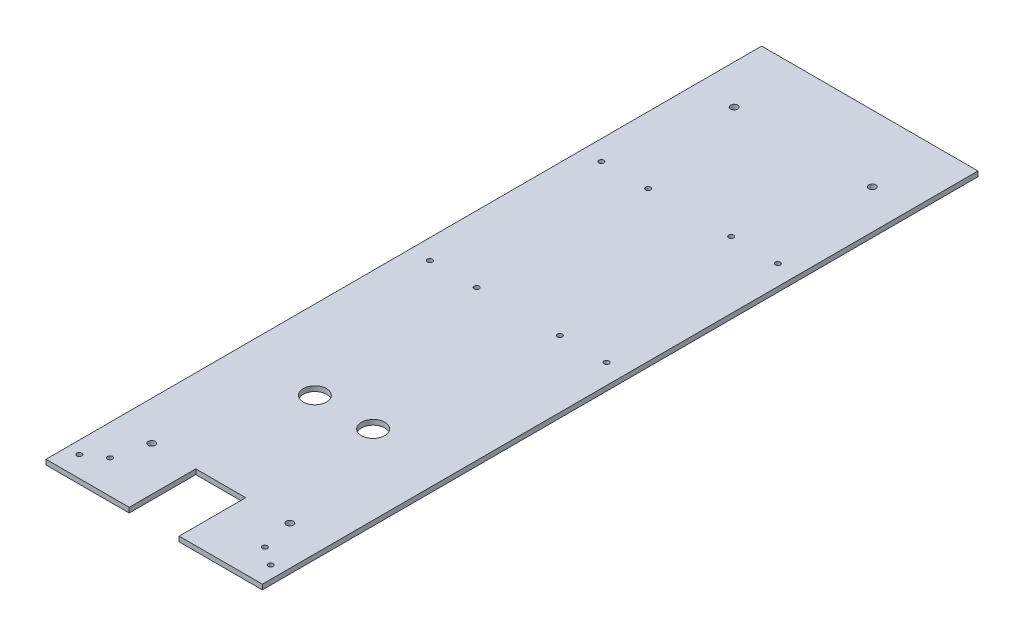
ISO-10303-21;
HEADER;
FILE_DESCRIPTION(('STEP AP214'),'2;1');
FILE_NAME('part.step','',(''),(''),'','','');
FILE_SCHEMA(('AUTOMOTIVE_DESIGN { 1 0 10303 214 1 1 1 1 }'));
ENDSEC;
DATA;
#1=APPLICATION_CONTEXT('core data for automotive mechanical design processes');
#2=APPLICATION_PROTOCOL_DEFINITION('international standard','automotive_design',2000,#1);
#3=PRODUCT_CONTEXT('',#1,'mechanical');
#4=PRODUCT('Part','Part','',(#3));
#5=PRODUCT_RELATED_PRODUCT_CATEGORY('part','',(#4));
#6=PRODUCT_DEFINITION_FORMATION('','',#4);
#7=PRODUCT_DEFINITION_CONTEXT('part definition',#1,'design');
#8=PRODUCT_DEFINITION('design','',#6,#7);
#9=PRODUCT_DEFINITION_SHAPE('','',#8);
#10=(LENGTH_UNIT() NAMED_UNIT(*) SI_UNIT(.MILLI.,.METRE.));
#11=(NAMED_UNIT(*) PLANE_ANGLE_UNIT() SI_UNIT($,.RADIAN.));
#12=(NAMED_UNIT(*) SI_UNIT($,.STERADIAN.) SOLID_ANGLE_UNIT());
#13=UNCERTAINTY_MEASURE_WITH_UNIT(LENGTH_MEASURE(1.E-05),#10,'distance_accuracy_value','');
#14=(GEOMETRIC_REPRESENTATION_CONTEXT(3) GLOBAL_UNCERTAINTY_ASSIGNED_CONTEXT((#13)) GLOBAL_UNIT_ASSIGNED_CONTEXT((#10,
#11,#12)) REPRESENTATION_CONTEXT('',''));
#15=CARTESIAN_POINT('',(0.,0.,0.));
#16=DIRECTION('',(0.,0.,1.));
#17=DIRECTION('',(1.,0.,0.));
#18=AXIS2_PLACEMENT_3D('',#15,#16,#17);
#19=CARTESIAN_POINT('',(-65.,3.,215.));
#20=DIRECTION('',(0.,0.,-1.));
#21=DIRECTION('',(-1.,0.,0.));
#22=AXIS2_PLACEMENT_3D('',#19,#20,#21);
#23=PLANE('',#22);
#24=DIRECTION('',(0.,1.,0.));
#25=VECTOR('',#24,1.);
#26=CARTESIAN_POINT('',(-15.0000000000001,-7.,215.));
#27=LINE('',#26,#25);
#28=CARTESIAN_POINT('',(-15.0000000000001,0.,215.));
#29=VERTEX_POINT('',#28);
#30=CARTESIAN_POINT('',(-15.0000000000001,3.,215.));
#31=VERTEX_POINT('',#30);
#32=EDGE_CURVE('E110',#29,#31,#27,.T.);
#33=ORIENTED_EDGE('',*,*,#32,.T.);
#34=DIRECTION('',(1.,0.,0.));
#35=VECTOR('',#34,1.);
#36=CARTESIAN_POINT('',(-65.,3.,215.));
#37=LINE('',#36,#35);
#38=CARTESIAN_POINT('',(-65.,3.,215.));
#39=VERTEX_POINT('',#38);
#40=EDGE_CURVE('E124',#39,#31,#37,.T.);
#41=ORIENTED_EDGE('',*,*,#40,.F.);
#42=DIRECTION('',(0.,-1.,0.));
#43=VECTOR('',#42,1.);
#44=CARTESIAN_POINT('',(-65.,3.,215.));
#45=LINE('',#44,#43);
#46=CARTESIAN_POINT('',(-65.,0.,215.));
#47=VERTEX_POINT('',#46);
#48=EDGE_CURVE('E135',#39,#47,#45,.T.);
#49=ORIENTED_EDGE('',*,*,#48,.T.);
#50=DIRECTION('',(1.,0.,0.));
#51=VECTOR('',#50,1.);
#52=CARTESIAN_POINT('',(-65.,0.,215.));
#53=LINE('',#52,#51);
#54=EDGE_CURVE('E126',#47,#29,#53,.T.);
#55=ORIENTED_EDGE('',*,*,#54,.T.);
#56=EDGE_LOOP('',(#33,#41,#49,#55));
#57=FACE_BOUND('',#56,.T.);
#58=ADVANCED_FACE('F33',(#57),#23,.F.);
#59=CARTESIAN_POINT('',(0.,3.,0.));
#60=DIRECTION('',(0.,1.,0.));
#61=DIRECTION('',(0.,0.,1.));
#62=AXIS2_PLACEMENT_3D('',#59,#60,#61);
#63=PLANE('',#62);
#64=CARTESIAN_POINT('',(17.4999999999999,3.,100.952208060622));
#65=DIRECTION('',(0.,1.,0.));
#66=DIRECTION('',(0.,0.,1.));
#67=AXIS2_PLACEMENT_3D('',#64,#65,#66);
#68=CIRCLE('',#67,7.);
#69=CARTESIAN_POINT('',(17.4999999999999,3.,107.952208060622));
#70=VERTEX_POINT('',#69);
#71=EDGE_CURVE('E280',#70,#70,#68,.T.);
#72=ORIENTED_EDGE('',*,*,#71,.F.);
#73=EDGE_LOOP('',(#72));
#74=FACE_BOUND('',#73,.T.);
#75=CARTESIAN_POINT('',(-17.5000000000001,3.,100.952208060622));
#76=DIRECTION('',(0.,1.,0.));
#77=DIRECTION('',(0.,0.,1.));
#78=AXIS2_PLACEMENT_3D('',#75,#76,#77);
#79=CIRCLE('',#78,7.);
#80=CARTESIAN_POINT('',(-17.5000000000001,3.,107.952208060622));
#81=VERTEX_POINT('',#80);
#82=EDGE_CURVE('E274',#81,#81,#79,.T.);
#83=ORIENTED_EDGE('',*,*,#82,.F.);
#84=EDGE_LOOP('',(#83));
#85=FACE_BOUND('',#84,.T.);
#86=CARTESIAN_POINT('',(-41.5000000000001,3.,-175.));
#87=DIRECTION('',(0.,1.,0.));
#88=DIRECTION('',(0.,0.,1.));
#89=AXIS2_PLACEMENT_3D('',#86,#87,#88);
#90=CIRCLE('',#89,2.09999999999999);
#91=CARTESIAN_POINT('',(-41.5000000000001,3.,-172.9));
#92=VERTEX_POINT('',#91);
#93=EDGE_CURVE('E268',#92,#92,#90,.T.);
#94=ORIENTED_EDGE('',*,*,#93,.F.);
#95=EDGE_LOOP('',(#94));
#96=FACE_BOUND('',#95,.T.);
#97=CARTESIAN_POINT('',(41.4999999999999,3.,-175.));
#98=DIRECTION('',(0.,1.,0.));
#99=DIRECTION('',(0.,0.,1.));
#100=AXIS2_PLACEMENT_3D('',#97,#98,#99);
#101=CIRCLE('',#100,2.09999999999999);
#102=CARTESIAN_POINT('',(41.4999999999999,3.,-172.9));
#103=VERTEX_POINT('',#102);
#104=EDGE_CURVE('E262',#103,#103,#101,.T.);
#105=ORIENTED_EDGE('',*,*,#104,.F.);
#106=EDGE_LOOP('',(#105));
#107=FACE_BOUND('',#106,.T.);
#108=CARTESIAN_POINT('',(41.5,3.,175.));
#109=DIRECTION('',(0.,1.,0.));
#110=DIRECTION('',(0.,0.,1.));
#111=AXIS2_PLACEMENT_3D('',#108,#109,#110);
#112=CIRCLE('',#111,2.09999999999999);
#113=CARTESIAN_POINT('',(41.5,3.,177.1));
#114=VERTEX_POINT('',#113);
#115=EDGE_CURVE('E256',#114,#114,#112,.T.);
#116=ORIENTED_EDGE('',*,*,#115,.F.);
#117=EDGE_LOOP('',(#116));
#118=FACE_BOUND('',#117,.T.);
#119=CARTESIAN_POINT('',(-41.5,3.,175.));
#120=DIRECTION('',(0.,1.,0.));
#121=DIRECTION('',(0.,0.,1.));
#122=AXIS2_PLACEMENT_3D('',#119,#120,#121);
#123=CIRCLE('',#122,2.09999999999999);
#124=CARTESIAN_POINT('',(-41.5,3.,177.1));
#125=VERTEX_POINT('',#124);
#126=EDGE_CURVE('E250',#125,#125,#123,.T.);
#127=ORIENTED_EDGE('',*,*,#126,.F.);
#128=EDGE_LOOP('',(#127));
#129=FACE_BOUND('',#128,.T.);
#130=CARTESIAN_POINT('',(53.05,3.,-3.75000000000119));
#131=DIRECTION('',(0.,1.,0.));
#132=DIRECTION('',(0.,0.,1.));
#133=AXIS2_PLACEMENT_3D('',#130,#131,#132);
#134=CIRCLE('',#133,1.5);
#135=CARTESIAN_POINT('',(53.05,3.,-2.25000000000118));
#136=VERTEX_POINT('',#135);
#137=EDGE_CURVE('E244',#136,#136,#134,.T.);
#138=ORIENTED_EDGE('',*,*,#137,.F.);
#139=EDGE_LOOP('',(#138));
#140=FACE_BOUND('',#139,.T.);
#141=CARTESIAN_POINT('',(-57.5,3.,202.5));
#142=DIRECTION('',(0.,1.,0.));
#143=DIRECTION('',(0.,0.,1.));
#144=AXIS2_PLACEMENT_3D('',#141,#142,#143);
#145=CIRCLE('',#144,1.5);
#146=CARTESIAN_POINT('',(-57.5,3.,204.));
#147=VERTEX_POINT('',#146);
#148=EDGE_CURVE('E238',#147,#147,#145,.T.);
#149=ORIENTED_EDGE('',*,*,#148,.F.);
#150=EDGE_LOOP('',(#149));
#151=FACE_BOUND('',#150,.T.);
#152=CARTESIAN_POINT('',(24.9500000000001,3.,-3.75000000000119));
#153=DIRECTION('',(0.,1.,0.));
#154=DIRECTION('',(0.,0.,1.));
#155=AXIS2_PLACEMENT_3D('',#152,#153,#154);
#156=CIRCLE('',#155,1.5);
#157=CARTESIAN_POINT('',(24.9500000000001,3.,-2.25000000000119));
#158=VERTEX_POINT('',#157);
#159=EDGE_CURVE('E232',#158,#158,#156,.T.);
#160=ORIENTED_EDGE('',*,*,#159,.F.);
#161=EDGE_LOOP('',(#160));
#162=FACE_BOUND('',#161,.T.);
#163=CARTESIAN_POINT('',(53.05,3.,-106.75));
#164=DIRECTION('',(0.,1.,0.));
#165=DIRECTION('',(0.,0.,1.));
#166=AXIS2_PLACEMENT_3D('',#163,#164,#165);
#167=CIRCLE('',#166,1.5);
#168=CARTESIAN_POINT('',(53.05,3.,-105.25));
#169=VERTEX_POINT('',#168);
#170=EDGE_CURVE('E226',#169,#169,#167,.T.);
#171=ORIENTED_EDGE('',*,*,#170,.F.);
#172=EDGE_LOOP('',(#171));
#173=FACE_BOUND('',#172,.T.);
#174=CARTESIAN_POINT('',(57.5,3.,202.5));
#175=DIRECTION('',(0.,1.,0.));
#176=DIRECTION('',(0.,0.,1.));
#177=AXIS2_PLACEMENT_3D('',#174,#175,#176);
#178=CIRCLE('',#177,1.5);
#179=CARTESIAN_POINT('',(57.5,3.,204.));
#180=VERTEX_POINT('',#179);
#181=EDGE_CURVE('E220',#180,#180,#178,.T.);
#182=ORIENTED_EDGE('',*,*,#181,.F.);
#183=EDGE_LOOP('',(#182));
#184=FACE_BOUND('',#183,.T.);
#185=CARTESIAN_POINT('',(24.95,3.,-106.75));
#186=DIRECTION('',(0.,1.,0.));
#187=DIRECTION('',(0.,0.,1.));
#188=AXIS2_PLACEMENT_3D('',#185,#186,#187);
#189=CIRCLE('',#188,1.5);
#190=CARTESIAN_POINT('',(24.95,3.,-105.25));
#191=VERTEX_POINT('',#190);
#192=EDGE_CURVE('E214',#191,#191,#189,.T.);
#193=ORIENTED_EDGE('',*,*,#192,.F.);
#194=EDGE_LOOP('',(#193));
#195=FACE_BOUND('',#194,.T.);
#196=CARTESIAN_POINT('',(-24.95,3.,-106.75));
#197=DIRECTION('',(0.,1.,0.));
#198=DIRECTION('',(0.,0.,1.));
#199=AXIS2_PLACEMENT_3D('',#196,#197,#198);
#200=CIRCLE('',#199,1.5);
#201=CARTESIAN_POINT('',(-24.95,3.,-105.25));
#202=VERTEX_POINT('',#201);
#203=EDGE_CURVE('E208',#202,#202,#200,.T.);
#204=ORIENTED_EDGE('',*,*,#203,.F.);
#205=EDGE_LOOP('',(#204));
#206=FACE_BOUND('',#205,.T.);
#207=CARTESIAN_POINT('',(46.5,3.,195.));
#208=DIRECTION('',(0.,1.,0.));
#209=DIRECTION('',(0.,0.,1.));
#210=AXIS2_PLACEMENT_3D('',#207,#208,#209);
#211=CIRCLE('',#210,1.5);
#212=CARTESIAN_POINT('',(46.5,3.,196.5));
#213=VERTEX_POINT('',#212);
#214=EDGE_CURVE('E202',#213,#213,#211,.T.);
#215=ORIENTED_EDGE('',*,*,#214,.F.);
#216=EDGE_LOOP('',(#215));
#217=FACE_BOUND('',#216,.T.);
#218=CARTESIAN_POINT('',(-53.05,3.,-106.75));
#219=DIRECTION('',(0.,1.,0.));
#220=DIRECTION('',(0.,0.,1.));
#221=AXIS2_PLACEMENT_3D('',#218,#219,#220);
#222=CIRCLE('',#221,1.5);
#223=CARTESIAN_POINT('',(-53.05,3.,-105.25));
#224=VERTEX_POINT('',#223);
#225=EDGE_CURVE('E196',#224,#224,#222,.T.);
#226=ORIENTED_EDGE('',*,*,#225,.F.);
#227=EDGE_LOOP('',(#226));
#228=FACE_BOUND('',#227,.T.);
#229=CARTESIAN_POINT('',(-24.9500000000001,3.,-3.75000000000119));
#230=DIRECTION('',(0.,1.,0.));
#231=DIRECTION('',(0.,0.,1.));
#232=AXIS2_PLACEMENT_3D('',#229,#230,#231);
#233=CIRCLE('',#232,1.5);
#234=CARTESIAN_POINT('',(-24.9500000000001,3.,-2.25000000000119));
#235=VERTEX_POINT('',#234);
#236=EDGE_CURVE('E190',#235,#235,#233,.T.);
#237=ORIENTED_EDGE('',*,*,#236,.F.);
#238=EDGE_LOOP('',(#237));
#239=FACE_BOUND('',#238,.T.);
#240=CARTESIAN_POINT('',(-46.5,3.,195.));
#241=DIRECTION('',(0.,1.,0.));
#242=DIRECTION('',(0.,0.,1.));
#243=AXIS2_PLACEMENT_3D('',#240,#241,#242);
#244=CIRCLE('',#243,1.5);
#245=CARTESIAN_POINT('',(-46.5,3.,196.5));
#246=VERTEX_POINT('',#245);
#247=EDGE_CURVE('E184',#246,#246,#244,.T.);
#248=ORIENTED_EDGE('',*,*,#247,.F.);
#249=EDGE_LOOP('',(#248));
#250=FACE_BOUND('',#249,.T.);
#251=CARTESIAN_POINT('',(-53.05,3.,-3.75000000000119));
#252=DIRECTION('',(0.,1.,0.));
#253=DIRECTION('',(0.,0.,1.));
#254=AXIS2_PLACEMENT_3D('',#251,#252,#253);
#255=CIRCLE('',#254,1.5);
#256=CARTESIAN_POINT('',(-53.05,3.,-2.25000000000118));
#257=VERTEX_POINT('',#256);
#258=EDGE_CURVE('E118',#257,#257,#255,.T.);
#259=ORIENTED_EDGE('',*,*,#258,.F.);
#260=EDGE_LOOP('',(#259));
#261=FACE_BOUND('',#260,.T.);
#262=ORIENTED_EDGE('',*,*,#40,.T.);
#263=DIRECTION('',(0.,0.,-1.));
#264=VECTOR('',#263,1.);
#265=CARTESIAN_POINT('',(-15.0000000000001,3.,215.));
#266=LINE('',#265,#264);
#267=CARTESIAN_POINT('',(-15.0000000000001,3.,175.));
#268=VERTEX_POINT('',#267);
#269=EDGE_CURVE('E107',#31,#268,#266,.T.);
#270=ORIENTED_EDGE('',*,*,#269,.T.);
#271=DIRECTION('',(-1.,0.,0.));
#272=VECTOR('',#271,1.);
#273=CARTESIAN_POINT('',(15.,3.,175.));
#274=LINE('',#273,#272);
#275=CARTESIAN_POINT('',(15.,3.,175.));
#276=VERTEX_POINT('',#275);
#277=EDGE_CURVE('E117',#276,#268,#274,.T.);
#278=ORIENTED_EDGE('',*,*,#277,.F.);
#279=DIRECTION('',(0.,0.,-1.));
#280=VECTOR('',#279,1.);
#281=CARTESIAN_POINT('',(15.,3.,215.));
#282=LINE('',#281,#280);
#283=CARTESIAN_POINT('',(15.,3.,215.));
#284=VERTEX_POINT('',#283);
#285=EDGE_CURVE('E175',#284,#276,#282,.T.);
#286=ORIENTED_EDGE('',*,*,#285,.F.);
#287=CARTESIAN_POINT('',(65.,3.,215.));
#288=VERTEX_POINT('',#287);
#289=EDGE_CURVE('E57',#284,#288,#37,.T.);
#290=ORIENTED_EDGE('',*,*,#289,.T.);
#291=DIRECTION('',(0.,0.,-1.));
#292=VECTOR('',#291,1.);
#293=CARTESIAN_POINT('',(64.9999999999999,3.,-215.));
#294=LINE('',#293,#292);
#295=CARTESIAN_POINT('',(64.9999999999999,3.,-215.));
#296=VERTEX_POINT('',#295);
#297=EDGE_CURVE('E146',#288,#296,#294,.T.);
#298=ORIENTED_EDGE('',*,*,#297,.T.);
#299=DIRECTION('',(-1.,0.,0.));
#300=VECTOR('',#299,1.);
#301=CARTESIAN_POINT('',(-65.0000000000001,3.,-215.));
#302=LINE('',#301,#300);
#303=CARTESIAN_POINT('',(-65.0000000000001,3.,-215.));
#304=VERTEX_POINT('',#303);
#305=EDGE_CURVE('E87',#296,#304,#302,.T.);
#306=ORIENTED_EDGE('',*,*,#305,.T.);
#307=DIRECTION('',(0.,0.,1.));
#308=VECTOR('',#307,1.);
#309=CARTESIAN_POINT('',(-65.0000000000001,3.,-215.));
#310=LINE('',#309,#308);
#311=EDGE_CURVE('E131',#304,#39,#310,.T.);
#312=ORIENTED_EDGE('',*,*,#311,.T.);
#313=EDGE_LOOP('',(#262,#270,#278,#286,#290,#298,#306,#312));
#314=FACE_BOUND('',#313,.T.);
#315=ADVANCED_FACE('F129',(#74,#85,#96,#107,#118,#129,#140,#151,#162,#173,#184,#195,#206,#217,
#228,#239,#250,#261,#314),#63,.T.);
#316=CARTESIAN_POINT('',(0.,0.,0.));
#317=DIRECTION('',(0.,1.,0.));
#318=DIRECTION('',(0.,0.,1.));
#319=AXIS2_PLACEMENT_3D('',#316,#317,#318);
#320=PLANE('',#319);
#321=CARTESIAN_POINT('',(17.4999999999999,0.,100.952208060622));
#322=DIRECTION('',(0.,-1.,0.));
#323=DIRECTION('',(0.,0.,-1.));
#324=AXIS2_PLACEMENT_3D('',#321,#322,#323);
#325=CIRCLE('',#324,7.);
#326=CARTESIAN_POINT('',(17.4999999999999,0.,93.9522080606222));
#327=VERTEX_POINT('',#326);
#328=EDGE_CURVE('E283',#327,#327,#325,.T.);
#329=ORIENTED_EDGE('',*,*,#328,.F.);
#330=EDGE_LOOP('',(#329));
#331=FACE_BOUND('',#330,.T.);
#332=CARTESIAN_POINT('',(-17.5000000000001,0.,100.952208060622));
#333=DIRECTION('',(0.,-1.,0.));
#334=DIRECTION('',(0.,0.,-1.));
#335=AXIS2_PLACEMENT_3D('',#332,#333,#334);
#336=CIRCLE('',#335,7.);
#337=CARTESIAN_POINT('',(-17.5000000000001,0.,93.9522080606222));
#338=VERTEX_POINT('',#337);
#339=EDGE_CURVE('E277',#338,#338,#336,.T.);
#340=ORIENTED_EDGE('',*,*,#339,.F.);
#341=EDGE_LOOP('',(#340));
#342=FACE_BOUND('',#341,.T.);
#343=CARTESIAN_POINT('',(-41.5000000000001,0.,-175.));
#344=DIRECTION('',(0.,-1.,0.));
#345=DIRECTION('',(0.,0.,-1.));
#346=AXIS2_PLACEMENT_3D('',#343,#344,#345);
#347=CIRCLE('',#346,2.09999999999999);
#348=CARTESIAN_POINT('',(-41.5000000000001,0.,-177.1));
#349=VERTEX_POINT('',#348);
#350=EDGE_CURVE('E271',#349,#349,#347,.T.);
#351=ORIENTED_EDGE('',*,*,#350,.F.);
#352=EDGE_LOOP('',(#351));
#353=FACE_BOUND('',#352,.T.);
#354=CARTESIAN_POINT('',(41.4999999999999,0.,-175.));
#355=DIRECTION('',(0.,-1.,0.));
#356=DIRECTION('',(0.,0.,-1.));
#357=AXIS2_PLACEMENT_3D('',#354,#355,#356);
#358=CIRCLE('',#357,2.09999999999999);
#359=CARTESIAN_POINT('',(41.4999999999999,0.,-177.1));
#360=VERTEX_POINT('',#359);
#361=EDGE_CURVE('E265',#360,#360,#358,.T.);
#362=ORIENTED_EDGE('',*,*,#361,.F.);
#363=EDGE_LOOP('',(#362));
#364=FACE_BOUND('',#363,.T.);
#365=CARTESIAN_POINT('',(41.5,0.,175.));
#366=DIRECTION('',(0.,-1.,0.));
#367=DIRECTION('',(0.,0.,-1.));
#368=AXIS2_PLACEMENT_3D('',#365,#366,#367);
#369=CIRCLE('',#368,2.09999999999999);
#370=CARTESIAN_POINT('',(41.5,0.,172.9));
#371=VERTEX_POINT('',#370);
#372=EDGE_CURVE('E259',#371,#371,#369,.T.);
#373=ORIENTED_EDGE('',*,*,#372,.F.);
#374=EDGE_LOOP('',(#373));
#375=FACE_BOUND('',#374,.T.);
#376=CARTESIAN_POINT('',(-41.5,0.,175.));
#377=DIRECTION('',(0.,-1.,0.));
#378=DIRECTION('',(0.,0.,-1.));
#379=AXIS2_PLACEMENT_3D('',#376,#377,#378);
#380=CIRCLE('',#379,2.09999999999999);
#381=CARTESIAN_POINT('',(-41.5,0.,172.9));
#382=VERTEX_POINT('',#381);
#383=EDGE_CURVE('E253',#382,#382,#380,.T.);
#384=ORIENTED_EDGE('',*,*,#383,.F.);
#385=EDGE_LOOP('',(#384));
#386=FACE_BOUND('',#385,.T.);
#387=CARTESIAN_POINT('',(53.05,0.,-3.75000000000119));
#388=DIRECTION('',(0.,-1.,0.));
#389=DIRECTION('',(0.,0.,1.));
#390=AXIS2_PLACEMENT_3D('',#387,#388,#389);
#391=CIRCLE('',#390,1.5);
#392=CARTESIAN_POINT('',(53.05,0.,-2.25000000000118));
#393=VERTEX_POINT('',#392);
#394=EDGE_CURVE('E247',#393,#393,#391,.T.);
#395=ORIENTED_EDGE('',*,*,#394,.F.);
#396=EDGE_LOOP('',(#395));
#397=FACE_BOUND('',#396,.T.);
#398=CARTESIAN_POINT('',(-57.5,0.,202.5));
#399=DIRECTION('',(0.,-1.,0.));
#400=DIRECTION('',(0.,0.,-1.));
#401=AXIS2_PLACEMENT_3D('',#398,#399,#400);
#402=CIRCLE('',#401,1.5);
#403=CARTESIAN_POINT('',(-57.5,0.,201.));
#404=VERTEX_POINT('',#403);
#405=EDGE_CURVE('E241',#404,#404,#402,.T.);
#406=ORIENTED_EDGE('',*,*,#405,.F.);
#407=EDGE_LOOP('',(#406));
#408=FACE_BOUND('',#407,.T.);
#409=CARTESIAN_POINT('',(24.9500000000001,0.,-3.75000000000119));
#410=DIRECTION('',(0.,-1.,0.));
#411=DIRECTION('',(0.,0.,1.));
#412=AXIS2_PLACEMENT_3D('',#409,#410,#411);
#413=CIRCLE('',#412,1.5);
#414=CARTESIAN_POINT('',(24.9500000000001,0.,-2.25000000000119));
#415=VERTEX_POINT('',#414);
#416=EDGE_CURVE('E235',#415,#415,#413,.T.);
#417=ORIENTED_EDGE('',*,*,#416,.F.);
#418=EDGE_LOOP('',(#417));
#419=FACE_BOUND('',#418,.T.);
#420=CARTESIAN_POINT('',(53.05,0.,-106.75));
#421=DIRECTION('',(0.,-1.,0.));
#422=DIRECTION('',(0.,0.,1.));
#423=AXIS2_PLACEMENT_3D('',#420,#421,#422);
#424=CIRCLE('',#423,1.5);
#425=CARTESIAN_POINT('',(53.05,0.,-105.25));
#426=VERTEX_POINT('',#425);
#427=EDGE_CURVE('E229',#426,#426,#424,.T.);
#428=ORIENTED_EDGE('',*,*,#427,.F.);
#429=EDGE_LOOP('',(#428));
#430=FACE_BOUND('',#429,.T.);
#431=CARTESIAN_POINT('',(57.5,0.,202.5));
#432=DIRECTION('',(0.,-1.,0.));
#433=DIRECTION('',(0.,0.,-1.));
#434=AXIS2_PLACEMENT_3D('',#431,#432,#433);
#435=CIRCLE('',#434,1.5);
#436=CARTESIAN_POINT('',(57.5,0.,201.));
#437=VERTEX_POINT('',#436);
#438=EDGE_CURVE('E223',#437,#437,#435,.T.);
#439=ORIENTED_EDGE('',*,*,#438,.F.);
#440=EDGE_LOOP('',(#439));
#441=FACE_BOUND('',#440,.T.);
#442=CARTESIAN_POINT('',(24.95,0.,-106.75));
#443=DIRECTION('',(0.,-1.,0.));
#444=DIRECTION('',(0.,0.,1.));
#445=AXIS2_PLACEMENT_3D('',#442,#443,#444);
#446=CIRCLE('',#445,1.5);
#447=CARTESIAN_POINT('',(24.95,0.,-105.25));
#448=VERTEX_POINT('',#447);
#449=EDGE_CURVE('E217',#448,#448,#446,.T.);
#450=ORIENTED_EDGE('',*,*,#449,.F.);
#451=EDGE_LOOP('',(#450));
#452=FACE_BOUND('',#451,.T.);
#453=CARTESIAN_POINT('',(-24.95,0.,-106.75));
#454=DIRECTION('',(0.,-1.,0.));
#455=DIRECTION('',(0.,0.,-1.));
#456=AXIS2_PLACEMENT_3D('',#453,#454,#455);
#457=CIRCLE('',#456,1.5);
#458=CARTESIAN_POINT('',(-24.95,0.,-108.25));
#459=VERTEX_POINT('',#458);
#460=EDGE_CURVE('E211',#459,#459,#457,.T.);
#461=ORIENTED_EDGE('',*,*,#460,.F.);
#462=EDGE_LOOP('',(#461));
#463=FACE_BOUND('',#462,.T.);
#464=CARTESIAN_POINT('',(46.5,0.,195.));
#465=DIRECTION('',(0.,-1.,0.));
#466=DIRECTION('',(0.,0.,-1.));
#467=AXIS2_PLACEMENT_3D('',#464,#465,#466);
#468=CIRCLE('',#467,1.5);
#469=CARTESIAN_POINT('',(46.5,0.,193.5));
#470=VERTEX_POINT('',#469);
#471=EDGE_CURVE('E205',#470,#470,#468,.T.);
#472=ORIENTED_EDGE('',*,*,#471,.F.);
#473=EDGE_LOOP('',(#472));
#474=FACE_BOUND('',#473,.T.);
#475=CARTESIAN_POINT('',(-53.05,0.,-106.75));
#476=DIRECTION('',(0.,-1.,0.));
#477=DIRECTION('',(0.,0.,-1.));
#478=AXIS2_PLACEMENT_3D('',#475,#476,#477);
#479=CIRCLE('',#478,1.5);
#480=CARTESIAN_POINT('',(-53.05,0.,-108.25));
#481=VERTEX_POINT('',#480);
#482=EDGE_CURVE('E199',#481,#481,#479,.T.);
#483=ORIENTED_EDGE('',*,*,#482,.F.);
#484=EDGE_LOOP('',(#483));
#485=FACE_BOUND('',#484,.T.);
#486=CARTESIAN_POINT('',(-24.9500000000001,0.,-3.75000000000119));
#487=DIRECTION('',(0.,-1.,0.));
#488=DIRECTION('',(0.,0.,-1.));
#489=AXIS2_PLACEMENT_3D('',#486,#487,#488);
#490=CIRCLE('',#489,1.5);
#491=CARTESIAN_POINT('',(-24.9500000000001,0.,-5.25000000000119));
#492=VERTEX_POINT('',#491);
#493=EDGE_CURVE('E193',#492,#492,#490,.T.);
#494=ORIENTED_EDGE('',*,*,#493,.F.);
#495=EDGE_LOOP('',(#494));
#496=FACE_BOUND('',#495,.T.);
#497=CARTESIAN_POINT('',(-46.5,0.,195.));
#498=DIRECTION('',(0.,-1.,0.));
#499=DIRECTION('',(0.,0.,-1.));
#500=AXIS2_PLACEMENT_3D('',#497,#498,#499);
#501=CIRCLE('',#500,1.5);
#502=CARTESIAN_POINT('',(-46.5,0.,193.5));
#503=VERTEX_POINT('',#502);
#504=EDGE_CURVE('E187',#503,#503,#501,.T.);
#505=ORIENTED_EDGE('',*,*,#504,.F.);
#506=EDGE_LOOP('',(#505));
#507=FACE_BOUND('',#506,.T.);
#508=CARTESIAN_POINT('',(-53.05,0.,-3.75000000000119));
#509=DIRECTION('',(0.,-1.,0.));
#510=DIRECTION('',(0.,0.,-1.));
#511=AXIS2_PLACEMENT_3D('',#508,#509,#510);
#512=CIRCLE('',#511,1.5);
#513=CARTESIAN_POINT('',(-53.05,0.,-5.25000000000119));
#514=VERTEX_POINT('',#513);
#515=EDGE_CURVE('E181',#514,#514,#512,.T.);
#516=ORIENTED_EDGE('',*,*,#515,.F.);
#517=EDGE_LOOP('',(#516));
#518=FACE_BOUND('',#517,.T.);
#519=DIRECTION('',(0.,0.,-1.));
#520=VECTOR('',#519,1.);
#521=CARTESIAN_POINT('',(-15.0000000000001,0.,0.));
#522=LINE('',#521,#520);
#523=CARTESIAN_POINT('',(-15.0000000000001,0.,175.));
#524=VERTEX_POINT('',#523);
#525=EDGE_CURVE('E11',#29,#524,#522,.T.);
#526=ORIENTED_EDGE('',*,*,#525,.F.);
#527=ORIENTED_EDGE('',*,*,#54,.F.);
#528=DIRECTION('',(0.,0.,1.));
#529=VECTOR('',#528,1.);
#530=CARTESIAN_POINT('',(-65.0000000000001,0.,-215.));
#531=LINE('',#530,#529);
#532=CARTESIAN_POINT('',(-65.0000000000001,0.,-215.));
#533=VERTEX_POINT('',#532);
#534=EDGE_CURVE('E144',#533,#47,#531,.T.);
#535=ORIENTED_EDGE('',*,*,#534,.F.);
#536=DIRECTION('',(-1.,0.,0.));
#537=VECTOR('',#536,1.);
#538=CARTESIAN_POINT('',(-65.0000000000001,0.,-215.));
#539=LINE('',#538,#537);
#540=CARTESIAN_POINT('',(64.9999999999999,0.,-215.));
#541=VERTEX_POINT('',#540);
#542=EDGE_CURVE('E142',#541,#533,#539,.T.);
#543=ORIENTED_EDGE('',*,*,#542,.F.);
#544=DIRECTION('',(0.,0.,-1.));
#545=VECTOR('',#544,1.);
#546=CARTESIAN_POINT('',(64.9999999999999,0.,-215.));
#547=LINE('',#546,#545);
#548=CARTESIAN_POINT('',(65.,0.,215.));
#549=VERTEX_POINT('',#548);
#550=EDGE_CURVE('E127',#549,#541,#547,.T.);
#551=ORIENTED_EDGE('',*,*,#550,.F.);
#552=CARTESIAN_POINT('',(15.,0.,215.));
#553=VERTEX_POINT('',#552);
#554=EDGE_CURVE('E79',#553,#549,#53,.T.);
#555=ORIENTED_EDGE('',*,*,#554,.F.);
#556=DIRECTION('',(0.,0.,-1.));
#557=VECTOR('',#556,1.);
#558=CARTESIAN_POINT('',(15.,0.,0.));
#559=LINE('',#558,#557);
#560=CARTESIAN_POINT('',(15.,0.,175.));
#561=VERTEX_POINT('',#560);
#562=EDGE_CURVE('E154',#553,#561,#559,.T.);
#563=ORIENTED_EDGE('',*,*,#562,.T.);
#564=DIRECTION('',(-1.,0.,0.));
#565=VECTOR('',#564,1.);
#566=CARTESIAN_POINT('',(0.,0.,175.));
#567=LINE('',#566,#565);
#568=EDGE_CURVE('E41',#561,#524,#567,.T.);
#569=ORIENTED_EDGE('',*,*,#568,.T.);
#570=EDGE_LOOP('',(#526,#527,#535,#543,#551,#555,#563,#569));
#571=FACE_BOUND('',#570,.T.);
#572=ADVANCED_FACE('F158',(#331,#342,#353,#364,#375,#386,#397,#408,#419,#430,#441,#452,#463,
#474,#485,#496,#507,#518,#571),#320,.F.);
#573=CARTESIAN_POINT('',(64.9999999999999,3.,-215.));
#574=DIRECTION('',(-1.,0.,0.));
#575=DIRECTION('',(0.,0.,1.));
#576=AXIS2_PLACEMENT_3D('',#573,#574,#575);
#577=PLANE('',#576);
#578=ORIENTED_EDGE('',*,*,#550,.T.);
#579=DIRECTION('',(0.,-1.,0.));
#580=VECTOR('',#579,1.);
#581=CARTESIAN_POINT('',(64.9999999999999,3.,-215.));
#582=LINE('',#581,#580);
#583=EDGE_CURVE('E152',#296,#541,#582,.T.);
#584=ORIENTED_EDGE('',*,*,#583,.F.);
#585=ORIENTED_EDGE('',*,*,#297,.F.);
#586=DIRECTION('',(0.,-1.,0.));
#587=VECTOR('',#586,1.);
#588=CARTESIAN_POINT('',(65.,3.,215.));
#589=LINE('',#588,#587);
#590=EDGE_CURVE('E133',#288,#549,#589,.T.);
#591=ORIENTED_EDGE('',*,*,#590,.T.);
#592=EDGE_LOOP('',(#578,#584,#585,#591));
#593=FACE_BOUND('',#592,.T.);
#594=ADVANCED_FACE('F35',(#593),#577,.F.);
#595=CARTESIAN_POINT('',(-65.0000000000001,3.,-215.));
#596=DIRECTION('',(0.,0.,1.));
#597=DIRECTION('',(1.,0.,0.));
#598=AXIS2_PLACEMENT_3D('',#595,#596,#597);
#599=PLANE('',#598);
#600=ORIENTED_EDGE('',*,*,#542,.T.);
#601=DIRECTION('',(0.,-1.,0.));
#602=VECTOR('',#601,1.);
#603=CARTESIAN_POINT('',(-65.0000000000001,3.,-215.));
#604=LINE('',#603,#602);
#605=EDGE_CURVE('E149',#304,#533,#604,.T.);
#606=ORIENTED_EDGE('',*,*,#605,.F.);
#607=ORIENTED_EDGE('',*,*,#305,.F.);
#608=ORIENTED_EDGE('',*,*,#583,.T.);
#609=EDGE_LOOP('',(#600,#606,#607,#608));
#610=FACE_BOUND('',#609,.T.);
#611=ADVANCED_FACE('F168',(#610),#599,.F.);
#612=CARTESIAN_POINT('',(-65.0000000000001,3.,-215.));
#613=DIRECTION('',(1.,0.,0.));
#614=DIRECTION('',(0.,0.,-1.));
#615=AXIS2_PLACEMENT_3D('',#612,#613,#614);
#616=PLANE('',#615);
#617=ORIENTED_EDGE('',*,*,#534,.T.);
#618=ORIENTED_EDGE('',*,*,#48,.F.);
#619=ORIENTED_EDGE('',*,*,#311,.F.);
#620=ORIENTED_EDGE('',*,*,#605,.T.);
#621=EDGE_LOOP('',(#617,#618,#619,#620));
#622=FACE_BOUND('',#621,.T.);
#623=ADVANCED_FACE('F171',(#622),#616,.F.);
#624=ORIENTED_EDGE('',*,*,#289,.F.);
#625=DIRECTION('',(0.,1.,0.));
#626=VECTOR('',#625,1.);
#627=CARTESIAN_POINT('',(15.,-7.,215.));
#628=LINE('',#627,#626);
#629=EDGE_CURVE('E162',#553,#284,#628,.T.);
#630=ORIENTED_EDGE('',*,*,#629,.F.);
#631=ORIENTED_EDGE('',*,*,#554,.T.);
#632=ORIENTED_EDGE('',*,*,#590,.F.);
#633=EDGE_LOOP('',(#624,#630,#631,#632));
#634=FACE_BOUND('',#633,.T.);
#635=ADVANCED_FACE('F174',(#634),#23,.F.);
#636=CARTESIAN_POINT('',(-15.0000000000001,-7.,215.));
#637=DIRECTION('',(1.,0.,0.));
#638=DIRECTION('',(0.,0.,-1.));
#639=AXIS2_PLACEMENT_3D('',#636,#637,#638);
#640=PLANE('',#639);
#641=ORIENTED_EDGE('',*,*,#525,.T.);
#642=DIRECTION('',(0.,1.,0.));
#643=VECTOR('',#642,1.);
#644=CARTESIAN_POINT('',(-15.0000000000001,-7.,175.));
#645=LINE('',#644,#643);
#646=EDGE_CURVE('E113',#524,#268,#645,.T.);
#647=ORIENTED_EDGE('',*,*,#646,.T.);
#648=ORIENTED_EDGE('',*,*,#269,.F.);
#649=ORIENTED_EDGE('',*,*,#32,.F.);
#650=EDGE_LOOP('',(#641,#647,#648,#649));
#651=FACE_BOUND('',#650,.T.);
#652=ADVANCED_FACE('F109',(#651),#640,.T.);
#653=CARTESIAN_POINT('',(15.,-7.,175.));
#654=DIRECTION('',(0.,0.,-1.));
#655=DIRECTION('',(-1.,0.,0.));
#656=AXIS2_PLACEMENT_3D('',#653,#654,#655);
#657=PLANE('',#656);
#658=DIRECTION('',(0.,1.,0.));
#659=VECTOR('',#658,1.);
#660=CARTESIAN_POINT('',(15.,-7.,175.));
#661=LINE('',#660,#659);
#662=EDGE_CURVE('E48',#561,#276,#661,.T.);
#663=ORIENTED_EDGE('',*,*,#662,.T.);
#664=ORIENTED_EDGE('',*,*,#277,.T.);
#665=ORIENTED_EDGE('',*,*,#646,.F.);
#666=ORIENTED_EDGE('',*,*,#568,.F.);
#667=EDGE_LOOP('',(#663,#664,#665,#666));
#668=FACE_BOUND('',#667,.T.);
#669=ADVANCED_FACE('F160',(#668),#657,.F.);
#670=CARTESIAN_POINT('',(15.,-7.,215.));
#671=DIRECTION('',(1.,0.,0.));
#672=DIRECTION('',(0.,0.,-1.));
#673=AXIS2_PLACEMENT_3D('',#670,#671,#672);
#674=PLANE('',#673);
#675=ORIENTED_EDGE('',*,*,#629,.T.);
#676=ORIENTED_EDGE('',*,*,#285,.T.);
#677=ORIENTED_EDGE('',*,*,#662,.F.);
#678=ORIENTED_EDGE('',*,*,#562,.F.);
#679=EDGE_LOOP('',(#675,#676,#677,#678));
#680=FACE_BOUND('',#679,.T.);
#681=ADVANCED_FACE('F329',(#680),#674,.F.);
#682=CARTESIAN_POINT('',(-53.05,10.,-3.75000000000119));
#683=DIRECTION('',(0.,-1.,0.));
#684=DIRECTION('',(0.,0.,-1.));
#685=AXIS2_PLACEMENT_3D('',#682,#683,#684);
#686=CYLINDRICAL_SURFACE('',#685,1.5);
#687=ORIENTED_EDGE('',*,*,#258,.T.);
#688=EDGE_LOOP('',(#687));
#689=FACE_BOUND('',#688,.T.);
#690=ORIENTED_EDGE('',*,*,#515,.T.);
#691=EDGE_LOOP('',(#690));
#692=FACE_BOUND('',#691,.T.);
#693=ADVANCED_FACE('F326',(#689,#692),#686,.F.);
#694=CARTESIAN_POINT('',(-46.5,10.,195.));
#695=DIRECTION('',(0.,-1.,0.));
#696=DIRECTION('',(0.,0.,-1.));
#697=AXIS2_PLACEMENT_3D('',#694,#695,#696);
#698=CYLINDRICAL_SURFACE('',#697,1.5);
#699=ORIENTED_EDGE('',*,*,#247,.T.);
#700=EDGE_LOOP('',(#699));
#701=FACE_BOUND('',#700,.T.);
#702=ORIENTED_EDGE('',*,*,#504,.T.);
#703=EDGE_LOOP('',(#702));
#704=FACE_BOUND('',#703,.T.);
#705=ADVANCED_FACE('F328',(#701,#704),#698,.F.);
#706=CARTESIAN_POINT('',(-24.9500000000001,10.,-3.75000000000119));
#707=DIRECTION('',(0.,-1.,0.));
#708=DIRECTION('',(0.,0.,-1.));
#709=AXIS2_PLACEMENT_3D('',#706,#707,#708);
#710=CYLINDRICAL_SURFACE('',#709,1.5);
#711=ORIENTED_EDGE('',*,*,#236,.T.);
#712=EDGE_LOOP('',(#711));
#713=FACE_BOUND('',#712,.T.);
#714=ORIENTED_EDGE('',*,*,#493,.T.);
#715=EDGE_LOOP('',(#714));
#716=FACE_BOUND('',#715,.T.);
#717=ADVANCED_FACE('F336',(#713,#716),#710,.F.);
#718=CARTESIAN_POINT('',(-53.05,10.,-106.75));
#719=DIRECTION('',(0.,-1.,0.));
#720=DIRECTION('',(0.,0.,-1.));
#721=AXIS2_PLACEMENT_3D('',#718,#719,#720);
#722=CYLINDRICAL_SURFACE('',#721,1.5);
#723=ORIENTED_EDGE('',*,*,#225,.T.);
#724=EDGE_LOOP('',(#723));
#725=FACE_BOUND('',#724,.T.);
#726=ORIENTED_EDGE('',*,*,#482,.T.);
#727=EDGE_LOOP('',(#726));
#728=FACE_BOUND('',#727,.T.);
#729=ADVANCED_FACE('F495',(#725,#728),#722,.F.);
#730=CARTESIAN_POINT('',(46.5,10.,195.));
#731=DIRECTION('',(0.,-1.,0.));
#732=DIRECTION('',(0.,0.,-1.));
#733=AXIS2_PLACEMENT_3D('',#730,#731,#732);
#734=CYLINDRICAL_SURFACE('',#733,1.5);
#735=ORIENTED_EDGE('',*,*,#214,.T.);
#736=EDGE_LOOP('',(#735));
#737=FACE_BOUND('',#736,.T.);
#738=ORIENTED_EDGE('',*,*,#471,.T.);
#739=EDGE_LOOP('',(#738));
#740=FACE_BOUND('',#739,.T.);
#741=ADVANCED_FACE('F485',(#737,#740),#734,.F.);
#742=CARTESIAN_POINT('',(-24.95,10.,-106.75));
#743=DIRECTION('',(0.,-1.,0.));
#744=DIRECTION('',(0.,0.,-1.));
#745=AXIS2_PLACEMENT_3D('',#742,#743,#744);
#746=CYLINDRICAL_SURFACE('',#745,1.5);
#747=ORIENTED_EDGE('',*,*,#203,.T.);
#748=EDGE_LOOP('',(#747));
#749=FACE_BOUND('',#748,.T.);
#750=ORIENTED_EDGE('',*,*,#460,.T.);
#751=EDGE_LOOP('',(#750));
#752=FACE_BOUND('',#751,.T.);
#753=ADVANCED_FACE('F475',(#749,#752),#746,.F.);
#754=CARTESIAN_POINT('',(24.95,10.,-106.75));
#755=DIRECTION('',(0.,-1.,0.));
#756=DIRECTION('',(0.,0.,-1.));
#757=AXIS2_PLACEMENT_3D('',#754,#755,#756);
#758=CYLINDRICAL_SURFACE('',#757,1.5);
#759=ORIENTED_EDGE('',*,*,#192,.T.);
#760=EDGE_LOOP('',(#759));
#761=FACE_BOUND('',#760,.T.);
#762=ORIENTED_EDGE('',*,*,#449,.T.);
#763=EDGE_LOOP('',(#762));
#764=FACE_BOUND('',#763,.T.);
#765=ADVANCED_FACE('F465',(#761,#764),#758,.F.);
#766=CARTESIAN_POINT('',(57.5,10.,202.5));
#767=DIRECTION('',(0.,-1.,0.));
#768=DIRECTION('',(0.,0.,-1.));
#769=AXIS2_PLACEMENT_3D('',#766,#767,#768);
#770=CYLINDRICAL_SURFACE('',#769,1.5);
#771=ORIENTED_EDGE('',*,*,#181,.T.);
#772=EDGE_LOOP('',(#771));
#773=FACE_BOUND('',#772,.T.);
#774=ORIENTED_EDGE('',*,*,#438,.T.);
#775=EDGE_LOOP('',(#774));
#776=FACE_BOUND('',#775,.T.);
#777=ADVANCED_FACE('F455',(#773,#776),#770,.F.);
#778=CARTESIAN_POINT('',(53.05,10.,-106.75));
#779=DIRECTION('',(0.,-1.,0.));
#780=DIRECTION('',(0.,0.,-1.));
#781=AXIS2_PLACEMENT_3D('',#778,#779,#780);
#782=CYLINDRICAL_SURFACE('',#781,1.5);
#783=ORIENTED_EDGE('',*,*,#170,.T.);
#784=EDGE_LOOP('',(#783));
#785=FACE_BOUND('',#784,.T.);
#786=ORIENTED_EDGE('',*,*,#427,.T.);
#787=EDGE_LOOP('',(#786));
#788=FACE_BOUND('',#787,.T.);
#789=ADVANCED_FACE('F445',(#785,#788),#782,.F.);
#790=CARTESIAN_POINT('',(24.9500000000001,10.,-3.75000000000119));
#791=DIRECTION('',(0.,-1.,0.));
#792=DIRECTION('',(0.,0.,-1.));
#793=AXIS2_PLACEMENT_3D('',#790,#791,#792);
#794=CYLINDRICAL_SURFACE('',#793,1.5);
#795=ORIENTED_EDGE('',*,*,#159,.T.);
#796=EDGE_LOOP('',(#795));
#797=FACE_BOUND('',#796,.T.);
#798=ORIENTED_EDGE('',*,*,#416,.T.);
#799=EDGE_LOOP('',(#798));
#800=FACE_BOUND('',#799,.T.);
#801=ADVANCED_FACE('F435',(#797,#800),#794,.F.);
#802=CARTESIAN_POINT('',(-57.5,10.,202.5));
#803=DIRECTION('',(0.,-1.,0.));
#804=DIRECTION('',(0.,0.,-1.));
#805=AXIS2_PLACEMENT_3D('',#802,#803,#804);
#806=CYLINDRICAL_SURFACE('',#805,1.5);
#807=ORIENTED_EDGE('',*,*,#148,.T.);
#808=EDGE_LOOP('',(#807));
#809=FACE_BOUND('',#808,.T.);
#810=ORIENTED_EDGE('',*,*,#405,.T.);
#811=EDGE_LOOP('',(#810));
#812=FACE_BOUND('',#811,.T.);
#813=ADVANCED_FACE('F425',(#809,#812),#806,.F.);
#814=CARTESIAN_POINT('',(53.05,10.,-3.75000000000119));
#815=DIRECTION('',(0.,-1.,0.));
#816=DIRECTION('',(0.,0.,-1.));
#817=AXIS2_PLACEMENT_3D('',#814,#815,#816);
#818=CYLINDRICAL_SURFACE('',#817,1.5);
#819=ORIENTED_EDGE('',*,*,#137,.T.);
#820=EDGE_LOOP('',(#819));
#821=FACE_BOUND('',#820,.T.);
#822=ORIENTED_EDGE('',*,*,#394,.T.);
#823=EDGE_LOOP('',(#822));
#824=FACE_BOUND('',#823,.T.);
#825=ADVANCED_FACE('F415',(#821,#824),#818,.F.);
#826=CARTESIAN_POINT('',(-41.5,10.,175.));
#827=DIRECTION('',(0.,-1.,0.));
#828=DIRECTION('',(0.,0.,-1.));
#829=AXIS2_PLACEMENT_3D('',#826,#827,#828);
#830=CYLINDRICAL_SURFACE('',#829,2.09999999999999);
#831=ORIENTED_EDGE('',*,*,#126,.T.);
#832=EDGE_LOOP('',(#831));
#833=FACE_BOUND('',#832,.T.);
#834=ORIENTED_EDGE('',*,*,#383,.T.);
#835=EDGE_LOOP('',(#834));
#836=FACE_BOUND('',#835,.T.);
#837=ADVANCED_FACE('F405',(#833,#836),#830,.F.);
#838=CARTESIAN_POINT('',(41.5,10.,175.));
#839=DIRECTION('',(0.,-1.,0.));
#840=DIRECTION('',(0.,0.,-1.));
#841=AXIS2_PLACEMENT_3D('',#838,#839,#840);
#842=CYLINDRICAL_SURFACE('',#841,2.09999999999999);
#843=ORIENTED_EDGE('',*,*,#115,.T.);
#844=EDGE_LOOP('',(#843));
#845=FACE_BOUND('',#844,.T.);
#846=ORIENTED_EDGE('',*,*,#372,.T.);
#847=EDGE_LOOP('',(#846));
#848=FACE_BOUND('',#847,.T.);
#849=ADVANCED_FACE('F395',(#845,#848),#842,.F.);
#850=CARTESIAN_POINT('',(41.4999999999999,10.,-175.));
#851=DIRECTION('',(0.,-1.,0.));
#852=DIRECTION('',(0.,0.,-1.));
#853=AXIS2_PLACEMENT_3D('',#850,#851,#852);
#854=CYLINDRICAL_SURFACE('',#853,2.09999999999999);
#855=ORIENTED_EDGE('',*,*,#104,.T.);
#856=EDGE_LOOP('',(#855));
#857=FACE_BOUND('',#856,.T.);
#858=ORIENTED_EDGE('',*,*,#361,.T.);
#859=EDGE_LOOP('',(#858));
#860=FACE_BOUND('',#859,.T.);
#861=ADVANCED_FACE('F383',(#857,#860),#854,.F.);
#862=CARTESIAN_POINT('',(-41.5000000000001,10.,-175.));
#863=DIRECTION('',(0.,-1.,0.));
#864=DIRECTION('',(0.,0.,-1.));
#865=AXIS2_PLACEMENT_3D('',#862,#863,#864);
#866=CYLINDRICAL_SURFACE('',#865,2.09999999999999);
#867=ORIENTED_EDGE('',*,*,#93,.T.);
#868=EDGE_LOOP('',(#867));
#869=FACE_BOUND('',#868,.T.);
#870=ORIENTED_EDGE('',*,*,#350,.T.);
#871=EDGE_LOOP('',(#870));
#872=FACE_BOUND('',#871,.T.);
#873=ADVANCED_FACE('F377',(#869,#872),#866,.F.);
#874=CARTESIAN_POINT('',(-17.5000000000001,10.,100.952208060622));
#875=DIRECTION('',(0.,-1.,0.));
#876=DIRECTION('',(0.,0.,-1.));
#877=AXIS2_PLACEMENT_3D('',#874,#875,#876);
#878=CYLINDRICAL_SURFACE('',#877,7.);
#879=ORIENTED_EDGE('',*,*,#82,.T.);
#880=EDGE_LOOP('',(#879));
#881=FACE_BOUND('',#880,.T.);
#882=ORIENTED_EDGE('',*,*,#339,.T.);
#883=EDGE_LOOP('',(#882));
#884=FACE_BOUND('',#883,.T.);
#885=ADVANCED_FACE('F382',(#881,#884),#878,.F.);
#886=CARTESIAN_POINT('',(17.4999999999999,10.,100.952208060622));
#887=DIRECTION('',(0.,-1.,0.));
#888=DIRECTION('',(0.,0.,-1.));
#889=AXIS2_PLACEMENT_3D('',#886,#887,#888);
#890=CYLINDRICAL_SURFACE('',#889,7.);
#891=ORIENTED_EDGE('',*,*,#71,.T.);
#892=EDGE_LOOP('',(#891));
#893=FACE_BOUND('',#892,.T.);
#894=ORIENTED_EDGE('',*,*,#328,.T.);
#895=EDGE_LOOP('',(#894));
#896=FACE_BOUND('',#895,.T.);
#897=ADVANCED_FACE('F287',(#893,#896),#890,.F.);
#898=CLOSED_SHELL('',(#58,#315,#572,#594,#611,#623,#635,#652,#669,#681,#693,#705,#717,#729,#741,
#753,#765,#777,#789,#801,#813,#825,#837,#849,#861,#873,#885,#897));
#899=MANIFOLD_SOLID_BREP('B2',#898);
#900=ADVANCED_BREP_SHAPE_REPRESENTATION('',(#18,#899),#14);
#901=SHAPE_DEFINITION_REPRESENTATION(#9,#900);
ENDSEC;
END-ISO-10303-21;
